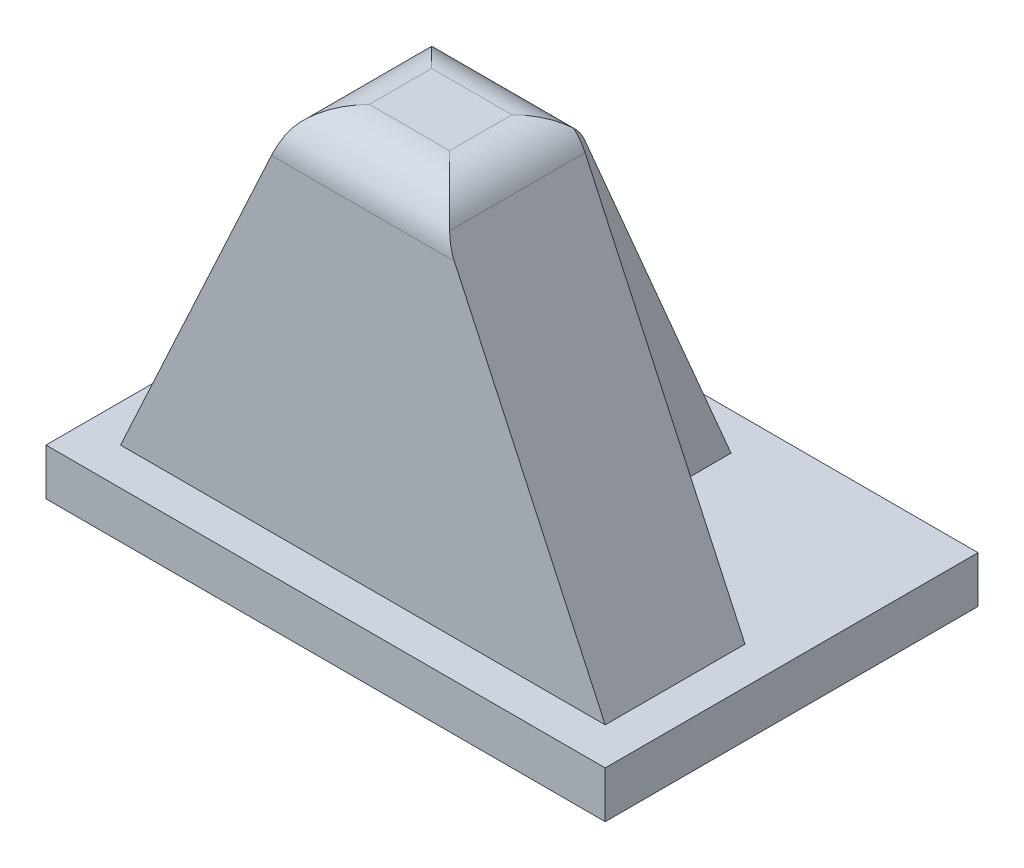
ISO-10303-21;
HEADER;
FILE_DESCRIPTION(('STEP AP214'),'2;1');
FILE_NAME('part.step','',(''),(''),'','','');
FILE_SCHEMA(('AUTOMOTIVE_DESIGN { 1 0 10303 214 1 1 1 1 }'));
ENDSEC;
DATA;
#1=APPLICATION_CONTEXT('core data for automotive mechanical design processes');
#2=APPLICATION_PROTOCOL_DEFINITION('international standard','automotive_design',2000,#1);
#3=PRODUCT_CONTEXT('',#1,'mechanical');
#4=PRODUCT('Part','Part','',(#3));
#5=PRODUCT_RELATED_PRODUCT_CATEGORY('part','',(#4));
#6=PRODUCT_DEFINITION_FORMATION('','',#4);
#7=PRODUCT_DEFINITION_CONTEXT('part definition',#1,'design');
#8=PRODUCT_DEFINITION('design','',#6,#7);
#9=PRODUCT_DEFINITION_SHAPE('','',#8);
#10=(LENGTH_UNIT() NAMED_UNIT(*) SI_UNIT(.MILLI.,.METRE.));
#11=(NAMED_UNIT(*) PLANE_ANGLE_UNIT() SI_UNIT($,.RADIAN.));
#12=(NAMED_UNIT(*) SI_UNIT($,.STERADIAN.) SOLID_ANGLE_UNIT());
#13=UNCERTAINTY_MEASURE_WITH_UNIT(LENGTH_MEASURE(1.E-05),#10,'distance_accuracy_value','');
#14=(GEOMETRIC_REPRESENTATION_CONTEXT(3) GLOBAL_UNCERTAINTY_ASSIGNED_CONTEXT((#13)) GLOBAL_UNIT_ASSIGNED_CONTEXT((#10,
#11,#12)) REPRESENTATION_CONTEXT('',''));
#15=CARTESIAN_POINT('',(0.,0.,0.));
#16=DIRECTION('',(0.,0.,1.));
#17=DIRECTION('',(1.,0.,0.));
#18=AXIS2_PLACEMENT_3D('',#15,#16,#17);
#19=CARTESIAN_POINT('',(0.,25.4,10.16));
#20=DIRECTION('',(0.,0.,-1.));
#21=DIRECTION('',(-1.,0.,0.));
#22=AXIS2_PLACEMENT_3D('',#19,#20,#21);
#23=PLANE('',#22);
#24=DIRECTION('',(-0.419777506360434,0.907627040779315,0.));
#25=VECTOR('',#24,1.);
#26=CARTESIAN_POINT('',(13.6007208134895,6.29033337623891,10.16));
#27=LINE('',#26,#25);
#28=CARTESIAN_POINT('',(16.51,0.,10.16));
#29=VERTEX_POINT('',#28);
#30=CARTESIAN_POINT('',(6.2309375,22.225,10.16));
#31=VERTEX_POINT('',#30);
#32=EDGE_CURVE('E163',#29,#31,#27,.T.);
#33=ORIENTED_EDGE('',*,*,#32,.T.);
#34=DIRECTION('',(1.,0.,0.));
#35=VECTOR('',#34,1.);
#36=CARTESIAN_POINT('',(-4.76249999999999,22.225,10.16));
#37=LINE('',#36,#35);
#38=CARTESIAN_POINT('',(-6.2309375,22.225,10.16));
#39=VERTEX_POINT('',#38);
#40=EDGE_CURVE('E249',#31,#39,#37,.F.);
#41=ORIENTED_EDGE('',*,*,#40,.T.);
#42=DIRECTION('',(0.419777506360433,0.907627040779315,0.));
#43=VECTOR('',#42,1.);
#44=CARTESIAN_POINT('',(-13.6007208134895,6.2903333762389,10.16));
#45=LINE('',#44,#43);
#46=CARTESIAN_POINT('',(-16.51,0.,10.16));
#47=VERTEX_POINT('',#46);
#48=EDGE_CURVE('E182',#47,#39,#45,.T.);
#49=ORIENTED_EDGE('',*,*,#48,.F.);
#50=DIRECTION('',(1.,0.,0.));
#51=VECTOR('',#50,1.);
#52=CARTESIAN_POINT('',(0.,0.,10.16));
#53=LINE('',#52,#51);
#54=EDGE_CURVE('E192',#47,#29,#53,.T.);
#55=ORIENTED_EDGE('',*,*,#54,.T.);
#56=EDGE_LOOP('',(#33,#41,#49,#55));
#57=FACE_BOUND('',#56,.T.);
#58=ADVANCED_FACE('F39',(#57),#23,.F.);
#59=CARTESIAN_POINT('',(0.,25.4,0.634999999999996));
#60=DIRECTION('',(0.,0.,-1.));
#61=DIRECTION('',(-1.,0.,0.));
#62=AXIS2_PLACEMENT_3D('',#59,#60,#61);
#63=PLANE('',#62);
#64=DIRECTION('',(-1.,0.,0.));
#65=VECTOR('',#64,1.);
#66=CARTESIAN_POINT('',(4.7625,24.6058919114225,0.634999999999996));
#67=LINE('',#66,#65);
#68=CARTESIAN_POINT('',(4.7625,24.6058919114225,0.634999999999996));
#69=VERTEX_POINT('',#68);
#70=CARTESIAN_POINT('',(4.83327568120052,24.6058919114225,0.634999999999996));
#71=VERTEX_POINT('',#70);
#72=EDGE_CURVE('E240',#69,#71,#67,.F.);
#73=ORIENTED_EDGE('',*,*,#72,.T.);
#74=CARTESIAN_POINT('',(2.73280461352953,22.225,0.634999999999996));
#75=DIRECTION('',(0.,0.,-1.));
#76=DIRECTION('',(-1.,0.,0.));
#77=AXIS2_PLACEMENT_3D('',#74,#75,#76);
#78=CIRCLE('',#77,3.175);
#79=CARTESIAN_POINT('',(5.61452046800385,23.5577935826944,0.634999999999996));
#80=VERTEX_POINT('',#79);
#81=EDGE_CURVE('E242',#71,#80,#78,.T.);
#82=ORIENTED_EDGE('',*,*,#81,.T.);
#83=DIRECTION('',(0.419777506360434,-0.907627040779315,0.));
#84=VECTOR('',#83,1.);
#85=CARTESIAN_POINT('',(3.92328485004505,27.2145192431458,0.634999999999996));
#86=LINE('',#85,#84);
#87=CARTESIAN_POINT('',(16.51,0.,0.634999999999995));
#88=VERTEX_POINT('',#87);
#89=EDGE_CURVE('E277',#80,#88,#86,.T.);
#90=ORIENTED_EDGE('',*,*,#89,.T.);
#91=DIRECTION('',(1.,0.,0.));
#92=VECTOR('',#91,1.);
#93=CARTESIAN_POINT('',(0.,0.,0.634999999999996));
#94=LINE('',#93,#92);
#95=CARTESIAN_POINT('',(4.7625,0.,0.634999999999996));
#96=VERTEX_POINT('',#95);
#97=EDGE_CURVE('E190',#96,#88,#94,.T.);
#98=ORIENTED_EDGE('',*,*,#97,.F.);
#99=DIRECTION('',(0.,-1.,0.));
#100=VECTOR('',#99,1.);
#101=CARTESIAN_POINT('',(4.7625,25.4,0.634999999999996));
#102=LINE('',#101,#100);
#103=EDGE_CURVE('E179',#69,#96,#102,.T.);
#104=ORIENTED_EDGE('',*,*,#103,.F.);
#105=EDGE_LOOP('',(#73,#82,#90,#98,#104));
#106=FACE_BOUND('',#105,.T.);
#107=ADVANCED_FACE('F295',(#106),#63,.T.);
#108=CARTESIAN_POINT('',(0.,25.4,0.));
#109=DIRECTION('',(0.,1.,0.));
#110=DIRECTION('',(0.,0.,1.));
#111=AXIS2_PLACEMENT_3D('',#108,#109,#110);
#112=PLANE('',#111);
#113=DIRECTION('',(1.,0.,0.));
#114=VECTOR('',#113,1.);
#115=CARTESIAN_POINT('',(4.7625,25.4,6.985));
#116=LINE('',#115,#114);
#117=CARTESIAN_POINT('',(-2.73280461352953,25.4,6.985));
#118=VERTEX_POINT('',#117);
#119=CARTESIAN_POINT('',(2.73280461352953,25.4,6.985));
#120=VERTEX_POINT('',#119);
#121=EDGE_CURVE('E235',#118,#120,#116,.T.);
#122=ORIENTED_EDGE('',*,*,#121,.T.);
#123=DIRECTION('',(0.,0.,-1.));
#124=VECTOR('',#123,1.);
#125=CARTESIAN_POINT('',(2.73280461352953,25.4,0.));
#126=LINE('',#125,#124);
#127=CARTESIAN_POINT('',(2.73280461352953,25.4,2.73547106767099));
#128=VERTEX_POINT('',#127);
#129=EDGE_CURVE('E237',#120,#128,#126,.T.);
#130=ORIENTED_EDGE('',*,*,#129,.T.);
#131=DIRECTION('',(1.,0.,0.));
#132=VECTOR('',#131,1.);
#133=CARTESIAN_POINT('',(-4.7625,25.4,2.73547106767099));
#134=LINE('',#133,#132);
#135=CARTESIAN_POINT('',(-2.73280461352953,25.4,2.73547106767099));
#136=VERTEX_POINT('',#135);
#137=EDGE_CURVE('E233',#128,#136,#134,.F.);
#138=ORIENTED_EDGE('',*,*,#137,.T.);
#139=DIRECTION('',(0.,0.,-1.));
#140=VECTOR('',#139,1.);
#141=CARTESIAN_POINT('',(-2.73280461352953,25.4,10.16));
#142=LINE('',#141,#140);
#143=EDGE_CURVE('E224',#136,#118,#142,.F.);
#144=ORIENTED_EDGE('',*,*,#143,.T.);
#145=EDGE_LOOP('',(#122,#130,#138,#144));
#146=FACE_BOUND('',#145,.T.);
#147=ADVANCED_FACE('F303',(#146),#112,.T.);
#148=CARTESIAN_POINT('',(19.05,-3.175,0.));
#149=DIRECTION('',(-1.,0.,0.));
#150=DIRECTION('',(0.,0.,1.));
#151=AXIS2_PLACEMENT_3D('',#148,#149,#150);
#152=PLANE('',#151);
#153=DIRECTION('',(0.,0.,1.));
#154=VECTOR('',#153,1.);
#155=CARTESIAN_POINT('',(19.05,0.,0.));
#156=LINE('',#155,#154);
#157=CARTESIAN_POINT('',(19.05,0.,-12.7));
#158=VERTEX_POINT('',#157);
#159=CARTESIAN_POINT('',(19.05,0.,12.7));
#160=VERTEX_POINT('',#159);
#161=EDGE_CURVE('E201',#158,#160,#156,.T.);
#162=ORIENTED_EDGE('',*,*,#161,.T.);
#163=DIRECTION('',(0.,1.,0.));
#164=VECTOR('',#163,1.);
#165=CARTESIAN_POINT('',(19.05,-3.175,12.7));
#166=LINE('',#165,#164);
#167=CARTESIAN_POINT('',(19.05,-3.175,12.7));
#168=VERTEX_POINT('',#167);
#169=EDGE_CURVE('E221',#168,#160,#166,.T.);
#170=ORIENTED_EDGE('',*,*,#169,.F.);
#171=DIRECTION('',(0.,0.,1.));
#172=VECTOR('',#171,1.);
#173=CARTESIAN_POINT('',(19.05,-3.175,0.));
#174=LINE('',#173,#172);
#175=CARTESIAN_POINT('',(19.05,-3.175,-12.7));
#176=VERTEX_POINT('',#175);
#177=EDGE_CURVE('E202',#176,#168,#174,.T.);
#178=ORIENTED_EDGE('',*,*,#177,.F.);
#179=DIRECTION('',(0.,1.,0.));
#180=VECTOR('',#179,1.);
#181=CARTESIAN_POINT('',(19.05,-3.175,-12.7));
#182=LINE('',#181,#180);
#183=EDGE_CURVE('E213',#176,#158,#182,.T.);
#184=ORIENTED_EDGE('',*,*,#183,.T.);
#185=EDGE_LOOP('',(#162,#170,#178,#184));
#186=FACE_BOUND('',#185,.T.);
#187=ADVANCED_FACE('F342',(#186),#152,.F.);
#188=CARTESIAN_POINT('',(0.,-3.175,12.7));
#189=DIRECTION('',(0.,0.,1.));
#190=DIRECTION('',(1.,0.,0.));
#191=AXIS2_PLACEMENT_3D('',#188,#189,#190);
#192=PLANE('',#191);
#193=DIRECTION('',(1.,0.,0.));
#194=VECTOR('',#193,1.);
#195=CARTESIAN_POINT('',(0.,0.,12.7));
#196=LINE('',#195,#194);
#197=CARTESIAN_POINT('',(-19.05,0.,12.7));
#198=VERTEX_POINT('',#197);
#199=EDGE_CURVE('E205',#198,#160,#196,.T.);
#200=ORIENTED_EDGE('',*,*,#199,.F.);
#201=DIRECTION('',(0.,1.,0.));
#202=VECTOR('',#201,1.);
#203=CARTESIAN_POINT('',(-19.05,-3.175,12.7));
#204=LINE('',#203,#202);
#205=CARTESIAN_POINT('',(-19.05,-3.175,12.7));
#206=VERTEX_POINT('',#205);
#207=EDGE_CURVE('E225',#206,#198,#204,.T.);
#208=ORIENTED_EDGE('',*,*,#207,.F.);
#209=DIRECTION('',(1.,0.,0.));
#210=VECTOR('',#209,1.);
#211=CARTESIAN_POINT('',(0.,-3.175,12.7));
#212=LINE('',#211,#210);
#213=EDGE_CURVE('E210',#206,#168,#212,.T.);
#214=ORIENTED_EDGE('',*,*,#213,.T.);
#215=ORIENTED_EDGE('',*,*,#169,.T.);
#216=EDGE_LOOP('',(#200,#208,#214,#215));
#217=FACE_BOUND('',#216,.T.);
#218=ADVANCED_FACE('F338',(#217),#192,.T.);
#219=CARTESIAN_POINT('',(-19.05,-3.175,0.));
#220=DIRECTION('',(-1.,0.,0.));
#221=DIRECTION('',(0.,0.,1.));
#222=AXIS2_PLACEMENT_3D('',#219,#220,#221);
#223=PLANE('',#222);
#224=DIRECTION('',(0.,0.,1.));
#225=VECTOR('',#224,1.);
#226=CARTESIAN_POINT('',(-19.05,0.,0.));
#227=LINE('',#226,#225);
#228=CARTESIAN_POINT('',(-19.05,0.,-12.7));
#229=VERTEX_POINT('',#228);
#230=EDGE_CURVE('E217',#229,#198,#227,.T.);
#231=ORIENTED_EDGE('',*,*,#230,.F.);
#232=DIRECTION('',(0.,1.,0.));
#233=VECTOR('',#232,1.);
#234=CARTESIAN_POINT('',(-19.05,-3.175,-12.7));
#235=LINE('',#234,#233);
#236=CARTESIAN_POINT('',(-19.05,-3.175,-12.7));
#237=VERTEX_POINT('',#236);
#238=EDGE_CURVE('E228',#237,#229,#235,.T.);
#239=ORIENTED_EDGE('',*,*,#238,.F.);
#240=DIRECTION('',(0.,0.,1.));
#241=VECTOR('',#240,1.);
#242=CARTESIAN_POINT('',(-19.05,-3.175,0.));
#243=LINE('',#242,#241);
#244=EDGE_CURVE('E207',#237,#206,#243,.T.);
#245=ORIENTED_EDGE('',*,*,#244,.T.);
#246=ORIENTED_EDGE('',*,*,#207,.T.);
#247=EDGE_LOOP('',(#231,#239,#245,#246));
#248=FACE_BOUND('',#247,.T.);
#249=ADVANCED_FACE('F341',(#248),#223,.T.);
#250=CARTESIAN_POINT('',(0.,-3.175,-12.7));
#251=DIRECTION('',(0.,0.,1.));
#252=DIRECTION('',(1.,0.,0.));
#253=AXIS2_PLACEMENT_3D('',#250,#251,#252);
#254=PLANE('',#253);
#255=DIRECTION('',(1.,0.,0.));
#256=VECTOR('',#255,1.);
#257=CARTESIAN_POINT('',(0.,0.,-12.7));
#258=LINE('',#257,#256);
#259=EDGE_CURVE('E215',#229,#158,#258,.T.);
#260=ORIENTED_EDGE('',*,*,#259,.T.);
#261=ORIENTED_EDGE('',*,*,#183,.F.);
#262=DIRECTION('',(1.,0.,0.));
#263=VECTOR('',#262,1.);
#264=CARTESIAN_POINT('',(0.,-3.175,-12.7));
#265=LINE('',#264,#263);
#266=EDGE_CURVE('E204',#237,#176,#265,.T.);
#267=ORIENTED_EDGE('',*,*,#266,.F.);
#268=ORIENTED_EDGE('',*,*,#238,.T.);
#269=EDGE_LOOP('',(#260,#261,#267,#268));
#270=FACE_BOUND('',#269,.T.);
#271=ADVANCED_FACE('F334',(#270),#254,.F.);
#272=CARTESIAN_POINT('',(0.,-3.175,0.));
#273=DIRECTION('',(0.,1.,0.));
#274=DIRECTION('',(0.,0.,1.));
#275=AXIS2_PLACEMENT_3D('',#272,#273,#274);
#276=PLANE('',#275);
#277=ORIENTED_EDGE('',*,*,#177,.T.);
#278=ORIENTED_EDGE('',*,*,#213,.F.);
#279=ORIENTED_EDGE('',*,*,#244,.F.);
#280=ORIENTED_EDGE('',*,*,#266,.T.);
#281=EDGE_LOOP('',(#277,#278,#279,#280));
#282=FACE_BOUND('',#281,.T.);
#283=ADVANCED_FACE('F331',(#282),#276,.F.);
#284=CARTESIAN_POINT('',(0.,0.,0.));
#285=DIRECTION('',(0.,1.,0.));
#286=DIRECTION('',(0.,0.,1.));
#287=AXIS2_PLACEMENT_3D('',#284,#285,#286);
#288=PLANE('',#287);
#289=DIRECTION('',(0.,0.,1.));
#290=VECTOR('',#289,1.);
#291=CARTESIAN_POINT('',(-4.7625,0.,0.));
#292=LINE('',#291,#290);
#293=CARTESIAN_POINT('',(-4.7625,0.,-10.16));
#294=VERTEX_POINT('',#293);
#295=CARTESIAN_POINT('',(-4.7625,0.,0.634999999999997));
#296=VERTEX_POINT('',#295);
#297=EDGE_CURVE('E175',#294,#296,#292,.T.);
#298=ORIENTED_EDGE('',*,*,#297,.F.);
#299=DIRECTION('',(1.,0.,0.));
#300=VECTOR('',#299,1.);
#301=CARTESIAN_POINT('',(0.,0.,-10.16));
#302=LINE('',#301,#300);
#303=CARTESIAN_POINT('',(4.7625,0.,-10.16));
#304=VERTEX_POINT('',#303);
#305=EDGE_CURVE('E156',#294,#304,#302,.T.);
#306=ORIENTED_EDGE('',*,*,#305,.T.);
#307=DIRECTION('',(0.,0.,1.));
#308=VECTOR('',#307,1.);
#309=CARTESIAN_POINT('',(4.7625,0.,0.));
#310=LINE('',#309,#308);
#311=EDGE_CURVE('E171',#304,#96,#310,.T.);
#312=ORIENTED_EDGE('',*,*,#311,.T.);
#313=ORIENTED_EDGE('',*,*,#97,.T.);
#314=DIRECTION('',(0.,0.,1.));
#315=VECTOR('',#314,1.);
#316=CARTESIAN_POINT('',(16.51,0.,0.));
#317=LINE('',#316,#315);
#318=EDGE_CURVE('E195',#88,#29,#317,.T.);
#319=ORIENTED_EDGE('',*,*,#318,.T.);
#320=ORIENTED_EDGE('',*,*,#54,.F.);
#321=DIRECTION('',(0.,0.,1.));
#322=VECTOR('',#321,1.);
#323=CARTESIAN_POINT('',(-16.51,0.,0.));
#324=LINE('',#323,#322);
#325=CARTESIAN_POINT('',(-16.51,0.,0.634999999999997));
#326=VERTEX_POINT('',#325);
#327=EDGE_CURVE('E189',#326,#47,#324,.T.);
#328=ORIENTED_EDGE('',*,*,#327,.F.);
#329=EDGE_CURVE('E187',#326,#296,#94,.T.);
#330=ORIENTED_EDGE('',*,*,#329,.T.);
#331=EDGE_LOOP('',(#298,#306,#312,#313,#319,#320,#328,#330));
#332=FACE_BOUND('',#331,.T.);
#333=ORIENTED_EDGE('',*,*,#230,.T.);
#334=ORIENTED_EDGE('',*,*,#199,.T.);
#335=ORIENTED_EDGE('',*,*,#161,.F.);
#336=ORIENTED_EDGE('',*,*,#259,.F.);
#337=EDGE_LOOP('',(#333,#334,#335,#336));
#338=FACE_BOUND('',#337,.T.);
#339=ADVANCED_FACE('F168',(#332,#338),#288,.T.);
#340=CARTESIAN_POINT('',(4.7625,25.4,0.));
#341=DIRECTION('',(1.,0.,0.));
#342=DIRECTION('',(0.,0.,-1.));
#343=AXIS2_PLACEMENT_3D('',#340,#341,#342);
#344=PLANE('',#343);
#345=DIRECTION('',(0.,-0.920330918458475,-0.391140640344852));
#346=VECTOR('',#345,1.);
#347=CARTESIAN_POINT('',(4.7625,25.1714134462679,0.53785071466384));
#348=LINE('',#347,#346);
#349=CARTESIAN_POINT('',(4.7625,23.4668715330949,-0.186579598434669));
#350=VERTEX_POINT('',#349);
#351=EDGE_CURVE('E152',#350,#304,#348,.T.);
#352=ORIENTED_EDGE('',*,*,#351,.F.);
#353=CARTESIAN_POINT('',(4.7625,22.225,2.73547106767099));
#354=DIRECTION('',(1.,0.,0.));
#355=DIRECTION('',(0.,0.,-1.));
#356=AXIS2_PLACEMENT_3D('',#353,#354,#355);
#357=CIRCLE('',#356,3.175);
#358=EDGE_CURVE('E256',#350,#69,#357,.T.);
#359=ORIENTED_EDGE('',*,*,#358,.T.);
#360=ORIENTED_EDGE('',*,*,#103,.T.);
#361=ORIENTED_EDGE('',*,*,#311,.F.);
#362=EDGE_LOOP('',(#352,#359,#360,#361));
#363=FACE_BOUND('',#362,.T.);
#364=ADVANCED_FACE('F177',(#363),#344,.T.);
#365=CARTESIAN_POINT('',(-4.7625,25.4,0.));
#366=DIRECTION('',(1.,0.,0.));
#367=DIRECTION('',(0.,0.,-1.));
#368=AXIS2_PLACEMENT_3D('',#365,#366,#367);
#369=PLANE('',#368);
#370=DIRECTION('',(0.,-1.,0.));
#371=VECTOR('',#370,1.);
#372=CARTESIAN_POINT('',(-4.7625,25.4,0.634999999999997));
#373=LINE('',#372,#371);
#374=CARTESIAN_POINT('',(-4.7625,24.6058919114225,0.634999999999997));
#375=VERTEX_POINT('',#374);
#376=EDGE_CURVE('E199',#375,#296,#373,.T.);
#377=ORIENTED_EDGE('',*,*,#376,.F.);
#378=CARTESIAN_POINT('',(-4.7625,22.225,2.73547106767099));
#379=DIRECTION('',(1.,0.,0.));
#380=DIRECTION('',(0.,0.,-1.));
#381=AXIS2_PLACEMENT_3D('',#378,#379,#380);
#382=CIRCLE('',#381,3.175);
#383=CARTESIAN_POINT('',(-4.7625,23.4668715330949,-0.186579598434666));
#384=VERTEX_POINT('',#383);
#385=EDGE_CURVE('E11',#375,#384,#382,.F.);
#386=ORIENTED_EDGE('',*,*,#385,.T.);
#387=DIRECTION('',(0.,-0.920330918458475,-0.391140640344852));
#388=VECTOR('',#387,1.);
#389=CARTESIAN_POINT('',(-4.7625,25.1714134462679,0.537850714663844));
#390=LINE('',#389,#388);
#391=EDGE_CURVE('E164',#384,#294,#390,.T.);
#392=ORIENTED_EDGE('',*,*,#391,.T.);
#393=ORIENTED_EDGE('',*,*,#297,.T.);
#394=EDGE_LOOP('',(#377,#386,#392,#393));
#395=FACE_BOUND('',#394,.T.);
#396=ADVANCED_FACE('F308',(#395),#369,.F.);
#397=CARTESIAN_POINT('',(-2.73280461352953,22.225,0.634999999999997));
#398=DIRECTION('',(0.,0.,-1.));
#399=DIRECTION('',(-1.,0.,0.));
#400=AXIS2_PLACEMENT_3D('',#397,#398,#399);
#401=CIRCLE('',#400,3.175);
#402=CARTESIAN_POINT('',(-5.61452046800385,23.5577935826944,0.634999999999997));
#403=VERTEX_POINT('',#402);
#404=CARTESIAN_POINT('',(-4.83327568120052,24.6058919114225,0.634999999999997));
#405=VERTEX_POINT('',#404);
#406=EDGE_CURVE('E56',#403,#405,#401,.T.);
#407=ORIENTED_EDGE('',*,*,#406,.T.);
#408=DIRECTION('',(-1.,0.,0.));
#409=VECTOR('',#408,1.);
#410=CARTESIAN_POINT('',(-5.1297749909671,24.6058919114225,0.634999999999997));
#411=LINE('',#410,#409);
#412=EDGE_CURVE('E48',#405,#375,#411,.F.);
#413=ORIENTED_EDGE('',*,*,#412,.T.);
#414=ORIENTED_EDGE('',*,*,#376,.T.);
#415=ORIENTED_EDGE('',*,*,#329,.F.);
#416=DIRECTION('',(-0.419777506360433,-0.907627040779315,0.));
#417=VECTOR('',#416,1.);
#418=CARTESIAN_POINT('',(-3.92328485004505,27.2145192431458,0.634999999999997));
#419=LINE('',#418,#417);
#420=EDGE_CURVE('E180',#403,#326,#419,.T.);
#421=ORIENTED_EDGE('',*,*,#420,.F.);
#422=EDGE_LOOP('',(#407,#413,#414,#415,#421));
#423=FACE_BOUND('',#422,.T.);
#424=ADVANCED_FACE('F307',(#423),#63,.T.);
#425=CARTESIAN_POINT('',(-13.6007208134895,6.2903333762389,-12.7));
#426=DIRECTION('',(0.907627040779315,-0.419777506360433,0.));
#427=DIRECTION('',(0.419777506360433,0.907627040779315,0.));
#428=AXIS2_PLACEMENT_3D('',#425,#426,#427);
#429=PLANE('',#428);
#430=ORIENTED_EDGE('',*,*,#48,.T.);
#431=CARTESIAN_POINT('',(-6.2309375,22.225,6.985));
#432=DIRECTION('',(0.907627040779315,-0.419777506360433,0.));
#433=DIRECTION('',(-0.419777506360433,-0.907627040779315,0.));
#434=AXIS2_PLACEMENT_3D('',#431,#432,#433);
#435=ELLIPSE('',#434,3.49813288647047,3.175);
#436=CARTESIAN_POINT('',(-5.61452046800385,23.5577935826944,9.86671585447432));
#437=VERTEX_POINT('',#436);
#438=EDGE_CURVE('E253',#39,#437,#435,.F.);
#439=ORIENTED_EDGE('',*,*,#438,.T.);
#440=DIRECTION('',(0.,0.,-1.));
#441=VECTOR('',#440,1.);
#442=CARTESIAN_POINT('',(-5.61452046800385,23.5577935826944,0.634999999999997));
#443=LINE('',#442,#441);
#444=EDGE_CURVE('E251',#437,#403,#443,.T.);
#445=ORIENTED_EDGE('',*,*,#444,.T.);
#446=ORIENTED_EDGE('',*,*,#420,.T.);
#447=ORIENTED_EDGE('',*,*,#327,.T.);
#448=EDGE_LOOP('',(#430,#439,#445,#446,#447));
#449=FACE_BOUND('',#448,.T.);
#450=ADVANCED_FACE('F281',(#449),#429,.F.);
#451=CARTESIAN_POINT('',(13.6007208134895,6.29033337623891,-12.7));
#452=DIRECTION('',(0.907627040779315,0.419777506360434,0.));
#453=DIRECTION('',(-0.419777506360434,0.907627040779315,0.));
#454=AXIS2_PLACEMENT_3D('',#451,#452,#453);
#455=PLANE('',#454);
#456=ORIENTED_EDGE('',*,*,#89,.F.);
#457=DIRECTION('',(0.,0.,-1.));
#458=VECTOR('',#457,1.);
#459=CARTESIAN_POINT('',(5.61452046800385,23.5577935826944,-12.7));
#460=LINE('',#459,#458);
#461=CARTESIAN_POINT('',(5.61452046800385,23.5577935826944,9.86671585447433));
#462=VERTEX_POINT('',#461);
#463=EDGE_CURVE('E246',#80,#462,#460,.F.);
#464=ORIENTED_EDGE('',*,*,#463,.T.);
#465=CARTESIAN_POINT('',(6.2309375,22.225,6.985));
#466=DIRECTION('',(0.907627040779315,0.419777506360434,0.));
#467=DIRECTION('',(-0.419777506360434,0.907627040779315,0.));
#468=AXIS2_PLACEMENT_3D('',#465,#466,#467);
#469=ELLIPSE('',#468,3.49813288647047,3.175);
#470=EDGE_CURVE('E244',#462,#31,#469,.T.);
#471=ORIENTED_EDGE('',*,*,#470,.T.);
#472=ORIENTED_EDGE('',*,*,#32,.F.);
#473=ORIENTED_EDGE('',*,*,#318,.F.);
#474=EDGE_LOOP('',(#456,#464,#471,#472,#473));
#475=FACE_BOUND('',#474,.T.);
#476=ADVANCED_FACE('F293',(#475),#455,.T.);
#477=CARTESIAN_POINT('',(-19.05,3.65738485971413,-8.60561143462149));
#478=DIRECTION('',(0.,-0.391140640344852,0.920330918458475));
#479=DIRECTION('',(0.,-0.920330918458475,-0.391140640344852));
#480=AXIS2_PLACEMENT_3D('',#477,#478,#479);
#481=PLANE('',#480);
#482=ORIENTED_EDGE('',*,*,#391,.F.);
#483=DIRECTION('',(1.,0.,0.));
#484=VECTOR('',#483,1.);
#485=CARTESIAN_POINT('',(4.7625,23.4668715330949,-0.186579598434669));
#486=LINE('',#485,#484);
#487=EDGE_CURVE('E159',#384,#350,#486,.T.);
#488=ORIENTED_EDGE('',*,*,#487,.T.);
#489=ORIENTED_EDGE('',*,*,#351,.T.);
#490=ORIENTED_EDGE('',*,*,#305,.F.);
#491=EDGE_LOOP('',(#482,#488,#489,#490));
#492=FACE_BOUND('',#491,.T.);
#493=ADVANCED_FACE('F155',(#492),#481,.F.);
#494=CARTESIAN_POINT('',(-2.73280461352953,22.225,-12.7));
#495=DIRECTION('',(0.,0.,1.));
#496=DIRECTION('',(1.,0.,0.));
#497=AXIS2_PLACEMENT_3D('',#494,#495,#496);
#498=CYLINDRICAL_SURFACE('',#497,3.175);
#499=ORIENTED_EDGE('',*,*,#406,.F.);
#500=ORIENTED_EDGE('',*,*,#444,.F.);
#501=CARTESIAN_POINT('',(-2.73280461352953,22.225,6.985));
#502=DIRECTION('',(0.707106781186547,0.,0.707106781186547));
#503=DIRECTION('',(-0.707106781186547,0.,0.707106781186547));
#504=AXIS2_PLACEMENT_3D('',#501,#502,#503);
#505=ELLIPSE('',#504,4.49012806053458,3.175);
#506=EDGE_CURVE('E43',#118,#437,#505,.T.);
#507=ORIENTED_EDGE('',*,*,#506,.F.);
#508=ORIENTED_EDGE('',*,*,#143,.F.);
#509=CARTESIAN_POINT('',(-2.73280461352953,22.225,2.73547106767099));
#510=DIRECTION('',(-0.707106781186547,0.,0.707106781186548));
#511=DIRECTION('',(0.707106781186548,0.,0.707106781186547));
#512=AXIS2_PLACEMENT_3D('',#509,#510,#511);
#513=ELLIPSE('',#512,4.49012806053458,3.175);
#514=EDGE_CURVE('E263',#405,#136,#513,.F.);
#515=ORIENTED_EDGE('',*,*,#514,.F.);
#516=EDGE_LOOP('',(#499,#500,#507,#508,#515));
#517=FACE_BOUND('',#516,.T.);
#518=ADVANCED_FACE('F41',(#517),#498,.T.);
#519=CARTESIAN_POINT('',(0.,22.225,6.985));
#520=DIRECTION('',(-1.,0.,0.));
#521=DIRECTION('',(0.,0.,1.));
#522=AXIS2_PLACEMENT_3D('',#519,#520,#521);
#523=CYLINDRICAL_SURFACE('',#522,3.175);
#524=ORIENTED_EDGE('',*,*,#40,.F.);
#525=ORIENTED_EDGE('',*,*,#470,.F.);
#526=CARTESIAN_POINT('',(2.73280461352953,22.225,6.985));
#527=DIRECTION('',(-0.707106781186548,0.,0.707106781186547));
#528=DIRECTION('',(-0.707106781186548,0.,-0.707106781186547));
#529=AXIS2_PLACEMENT_3D('',#526,#527,#528);
#530=ELLIPSE('',#529,4.49012806053458,3.175);
#531=EDGE_CURVE('E262',#120,#462,#530,.F.);
#532=ORIENTED_EDGE('',*,*,#531,.F.);
#533=ORIENTED_EDGE('',*,*,#121,.F.);
#534=ORIENTED_EDGE('',*,*,#506,.T.);
#535=ORIENTED_EDGE('',*,*,#438,.F.);
#536=EDGE_LOOP('',(#524,#525,#532,#533,#534,#535));
#537=FACE_BOUND('',#536,.T.);
#538=ADVANCED_FACE('F287',(#537),#523,.T.);
#539=CARTESIAN_POINT('',(-19.05,22.225,2.73547106767099));
#540=DIRECTION('',(-1.,0.,0.));
#541=DIRECTION('',(0.,0.,1.));
#542=AXIS2_PLACEMENT_3D('',#539,#540,#541);
#543=CYLINDRICAL_SURFACE('',#542,3.175);
#544=ORIENTED_EDGE('',*,*,#514,.T.);
#545=ORIENTED_EDGE('',*,*,#137,.F.);
#546=CARTESIAN_POINT('',(2.73280461352953,22.225,2.73547106767099));
#547=DIRECTION('',(-0.707106781186548,0.,-0.707106781186547));
#548=DIRECTION('',(-0.707106781186547,0.,0.707106781186547));
#549=AXIS2_PLACEMENT_3D('',#546,#547,#548);
#550=ELLIPSE('',#549,4.49012806053458,3.175);
#551=EDGE_CURVE('E260',#71,#128,#550,.F.);
#552=ORIENTED_EDGE('',*,*,#551,.F.);
#553=ORIENTED_EDGE('',*,*,#72,.F.);
#554=ORIENTED_EDGE('',*,*,#358,.F.);
#555=ORIENTED_EDGE('',*,*,#487,.F.);
#556=ORIENTED_EDGE('',*,*,#385,.F.);
#557=ORIENTED_EDGE('',*,*,#412,.F.);
#558=EDGE_LOOP('',(#544,#545,#552,#553,#554,#555,#556,#557));
#559=FACE_BOUND('',#558,.T.);
#560=ADVANCED_FACE('F310',(#559),#543,.T.);
#561=CARTESIAN_POINT('',(2.73280461352953,22.225,0.));
#562=DIRECTION('',(0.,0.,-1.));
#563=DIRECTION('',(-1.,0.,0.));
#564=AXIS2_PLACEMENT_3D('',#561,#562,#563);
#565=CYLINDRICAL_SURFACE('',#564,3.175);
#566=ORIENTED_EDGE('',*,*,#531,.T.);
#567=ORIENTED_EDGE('',*,*,#463,.F.);
#568=ORIENTED_EDGE('',*,*,#81,.F.);
#569=ORIENTED_EDGE('',*,*,#551,.T.);
#570=ORIENTED_EDGE('',*,*,#129,.F.);
#571=EDGE_LOOP('',(#566,#567,#568,#569,#570));
#572=FACE_BOUND('',#571,.T.);
#573=ADVANCED_FACE('F300',(#572),#565,.T.);
#574=CLOSED_SHELL('',(#58,#107,#147,#187,#218,#249,#271,#283,#339,#364,#396,#424,#450,#476,#493,
#518,#538,#560,#573));
#575=MANIFOLD_SOLID_BREP('B2',#574);
#576=ADVANCED_BREP_SHAPE_REPRESENTATION('',(#18,#575),#14);
#577=SHAPE_DEFINITION_REPRESENTATION(#9,#576);
ENDSEC;
END-ISO-10303-21;
